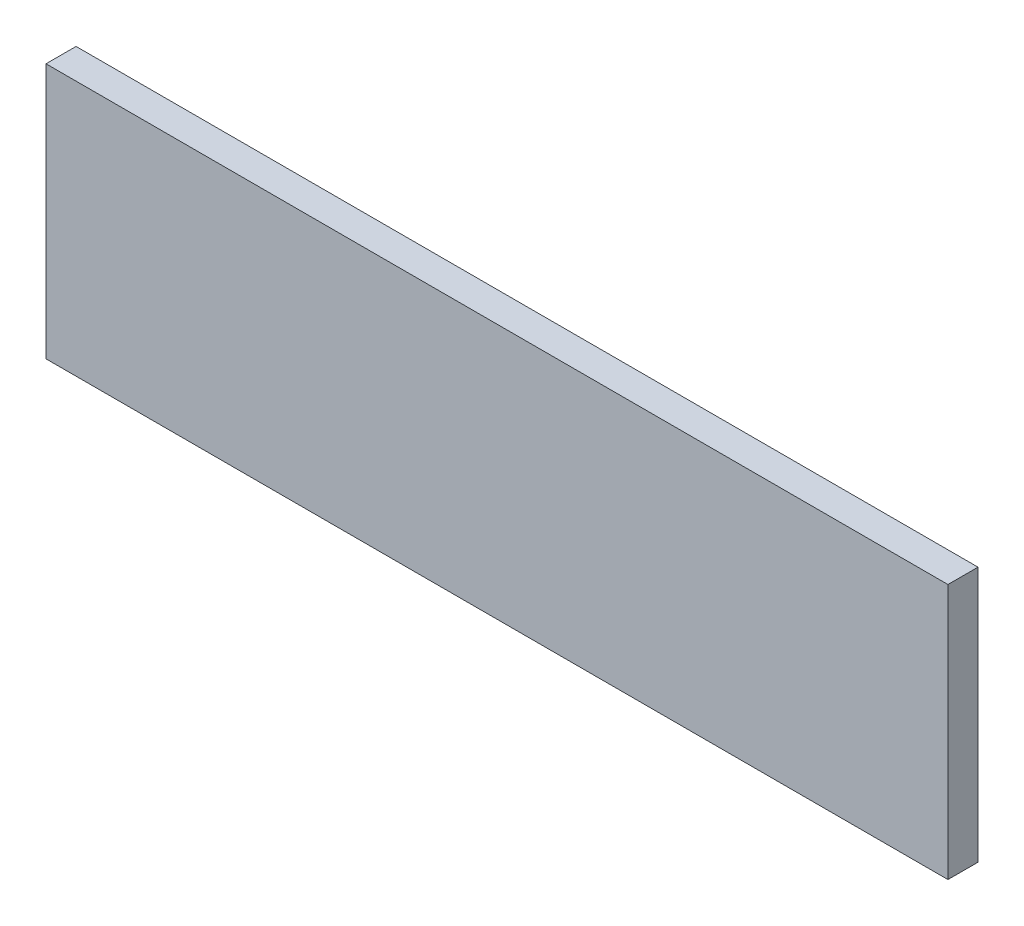
ISO-10303-21;
HEADER;
FILE_DESCRIPTION(('STEP AP214'),'2;1');
FILE_NAME('part.step','',(''),(''),'','','');
FILE_SCHEMA(('AUTOMOTIVE_DESIGN { 1 0 10303 214 1 1 1 1 }'));
ENDSEC;
DATA;
#1=APPLICATION_CONTEXT('core data for automotive mechanical design processes');
#2=APPLICATION_PROTOCOL_DEFINITION('international standard','automotive_design',2000,#1);
#3=PRODUCT_CONTEXT('',#1,'mechanical');
#4=PRODUCT('Part','Part','',(#3));
#5=PRODUCT_RELATED_PRODUCT_CATEGORY('part','',(#4));
#6=PRODUCT_DEFINITION_FORMATION('','',#4);
#7=PRODUCT_DEFINITION_CONTEXT('part definition',#1,'design');
#8=PRODUCT_DEFINITION('design','',#6,#7);
#9=PRODUCT_DEFINITION_SHAPE('','',#8);
#10=(LENGTH_UNIT() NAMED_UNIT(*) SI_UNIT(.MILLI.,.METRE.));
#11=(NAMED_UNIT(*) PLANE_ANGLE_UNIT() SI_UNIT($,.RADIAN.));
#12=(NAMED_UNIT(*) SI_UNIT($,.STERADIAN.) SOLID_ANGLE_UNIT());
#13=UNCERTAINTY_MEASURE_WITH_UNIT(LENGTH_MEASURE(1.E-05),#10,'distance_accuracy_value','');
#14=(GEOMETRIC_REPRESENTATION_CONTEXT(3) GLOBAL_UNCERTAINTY_ASSIGNED_CONTEXT((#13)) GLOBAL_UNIT_ASSIGNED_CONTEXT((#10,
#11,#12)) REPRESENTATION_CONTEXT('',''));
#15=CARTESIAN_POINT('',(0.,0.,0.));
#16=DIRECTION('',(0.,0.,1.));
#17=DIRECTION('',(1.,0.,0.));
#18=AXIS2_PLACEMENT_3D('',#15,#16,#17);
#19=CARTESIAN_POINT('',(-36.1662707528454,22.3328025477707,5.));
#20=DIRECTION('',(1.,0.,0.));
#21=DIRECTION('',(0.,0.,-1.));
#22=AXIS2_PLACEMENT_3D('',#19,#20,#21);
#23=PLANE('',#22);
#24=DIRECTION('',(0.,-1.,0.));
#25=VECTOR('',#24,1.);
#26=CARTESIAN_POINT('',(-36.1662707528454,22.3328025477707,0.));
#27=LINE('',#26,#25);
#28=CARTESIAN_POINT('',(-36.1662707528454,22.3328025477707,0.));
#29=VERTEX_POINT('',#28);
#30=CARTESIAN_POINT('',(-36.1662707528454,-20.1671974522293,0.));
#31=VERTEX_POINT('',#30);
#32=EDGE_CURVE('E96',#29,#31,#27,.T.);
#33=ORIENTED_EDGE('',*,*,#32,.T.);
#34=DIRECTION('',(0.,0.,-1.));
#35=VECTOR('',#34,1.);
#36=CARTESIAN_POINT('',(-36.1662707528454,-20.1671974522293,5.));
#37=LINE('',#36,#35);
#38=CARTESIAN_POINT('',(-36.1662707528454,-20.1671974522293,5.));
#39=VERTEX_POINT('',#38);
#40=EDGE_CURVE('E11',#39,#31,#37,.T.);
#41=ORIENTED_EDGE('',*,*,#40,.F.);
#42=DIRECTION('',(0.,-1.,0.));
#43=VECTOR('',#42,1.);
#44=CARTESIAN_POINT('',(-36.1662707528454,22.3328025477707,5.));
#45=LINE('',#44,#43);
#46=CARTESIAN_POINT('',(-36.1662707528454,22.3328025477707,5.));
#47=VERTEX_POINT('',#46);
#48=EDGE_CURVE('E84',#47,#39,#45,.T.);
#49=ORIENTED_EDGE('',*,*,#48,.F.);
#50=DIRECTION('',(0.,0.,-1.));
#51=VECTOR('',#50,1.);
#52=CARTESIAN_POINT('',(-36.1662707528454,22.3328025477707,5.));
#53=LINE('',#52,#51);
#54=EDGE_CURVE('E92',#47,#29,#53,.T.);
#55=ORIENTED_EDGE('',*,*,#54,.T.);
#56=EDGE_LOOP('',(#33,#41,#49,#55));
#57=FACE_BOUND('',#56,.T.);
#58=ADVANCED_FACE('F33',(#57),#23,.F.);
#59=CARTESIAN_POINT('',(-36.1662707528454,-20.1671974522293,5.));
#60=DIRECTION('',(0.,1.,0.));
#61=DIRECTION('',(0.,0.,1.));
#62=AXIS2_PLACEMENT_3D('',#59,#60,#61);
#63=PLANE('',#62);
#64=DIRECTION('',(1.,0.,0.));
#65=VECTOR('',#64,1.);
#66=CARTESIAN_POINT('',(-36.1662707528454,-20.1671974522293,0.));
#67=LINE('',#66,#65);
#68=CARTESIAN_POINT('',(113.833729247155,-20.1671974522293,0.));
#69=VERTEX_POINT('',#68);
#70=EDGE_CURVE('E88',#31,#69,#67,.T.);
#71=ORIENTED_EDGE('',*,*,#70,.T.);
#72=DIRECTION('',(0.,0.,-1.));
#73=VECTOR('',#72,1.);
#74=CARTESIAN_POINT('',(113.833729247155,-20.1671974522293,5.));
#75=LINE('',#74,#73);
#76=CARTESIAN_POINT('',(113.833729247155,-20.1671974522293,5.));
#77=VERTEX_POINT('',#76);
#78=EDGE_CURVE('E41',#77,#69,#75,.T.);
#79=ORIENTED_EDGE('',*,*,#78,.F.);
#80=DIRECTION('',(1.,0.,0.));
#81=VECTOR('',#80,1.);
#82=CARTESIAN_POINT('',(-36.1662707528454,-20.1671974522293,5.));
#83=LINE('',#82,#81);
#84=EDGE_CURVE('E79',#39,#77,#83,.T.);
#85=ORIENTED_EDGE('',*,*,#84,.F.);
#86=ORIENTED_EDGE('',*,*,#40,.T.);
#87=EDGE_LOOP('',(#71,#79,#85,#86));
#88=FACE_BOUND('',#87,.T.);
#89=ADVANCED_FACE('F87',(#88),#63,.F.);
#90=CARTESIAN_POINT('',(113.833729247155,22.3328025477707,5.));
#91=DIRECTION('',(-1.,0.,0.));
#92=DIRECTION('',(0.,0.,1.));
#93=AXIS2_PLACEMENT_3D('',#90,#91,#92);
#94=PLANE('',#93);
#95=DIRECTION('',(0.,1.,0.));
#96=VECTOR('',#95,1.);
#97=CARTESIAN_POINT('',(113.833729247155,22.3328025477707,0.));
#98=LINE('',#97,#96);
#99=CARTESIAN_POINT('',(113.833729247155,22.3328025477707,0.));
#100=VERTEX_POINT('',#99);
#101=EDGE_CURVE('E66',#69,#100,#98,.T.);
#102=ORIENTED_EDGE('',*,*,#101,.T.);
#103=DIRECTION('',(0.,0.,-1.));
#104=VECTOR('',#103,1.);
#105=CARTESIAN_POINT('',(113.833729247155,22.3328025477707,5.));
#106=LINE('',#105,#104);
#107=CARTESIAN_POINT('',(113.833729247155,22.3328025477707,5.));
#108=VERTEX_POINT('',#107);
#109=EDGE_CURVE('E89',#108,#100,#106,.T.);
#110=ORIENTED_EDGE('',*,*,#109,.F.);
#111=DIRECTION('',(0.,1.,0.));
#112=VECTOR('',#111,1.);
#113=CARTESIAN_POINT('',(113.833729247155,22.3328025477707,5.));
#114=LINE('',#113,#112);
#115=EDGE_CURVE('E82',#77,#108,#114,.T.);
#116=ORIENTED_EDGE('',*,*,#115,.F.);
#117=ORIENTED_EDGE('',*,*,#78,.T.);
#118=EDGE_LOOP('',(#102,#110,#116,#117));
#119=FACE_BOUND('',#118,.T.);
#120=ADVANCED_FACE('F90',(#119),#94,.F.);
#121=CARTESIAN_POINT('',(-36.1662707528454,22.3328025477707,5.));
#122=DIRECTION('',(0.,-1.,0.));
#123=DIRECTION('',(0.,0.,-1.));
#124=AXIS2_PLACEMENT_3D('',#121,#122,#123);
#125=PLANE('',#124);
#126=DIRECTION('',(-1.,0.,0.));
#127=VECTOR('',#126,1.);
#128=CARTESIAN_POINT('',(-36.1662707528454,22.3328025477707,0.));
#129=LINE('',#128,#127);
#130=EDGE_CURVE('E72',#100,#29,#129,.T.);
#131=ORIENTED_EDGE('',*,*,#130,.T.);
#132=ORIENTED_EDGE('',*,*,#54,.F.);
#133=DIRECTION('',(-1.,0.,0.));
#134=VECTOR('',#133,1.);
#135=CARTESIAN_POINT('',(-36.1662707528454,22.3328025477707,5.));
#136=LINE('',#135,#134);
#137=EDGE_CURVE('E49',#108,#47,#136,.T.);
#138=ORIENTED_EDGE('',*,*,#137,.F.);
#139=ORIENTED_EDGE('',*,*,#109,.T.);
#140=EDGE_LOOP('',(#131,#132,#138,#139));
#141=FACE_BOUND('',#140,.T.);
#142=ADVANCED_FACE('F103',(#141),#125,.F.);
#143=CARTESIAN_POINT('',(0.,0.,5.));
#144=DIRECTION('',(0.,0.,1.));
#145=DIRECTION('',(1.,0.,0.));
#146=AXIS2_PLACEMENT_3D('',#143,#144,#145);
#147=PLANE('',#146);
#148=ORIENTED_EDGE('',*,*,#48,.T.);
#149=ORIENTED_EDGE('',*,*,#84,.T.);
#150=ORIENTED_EDGE('',*,*,#115,.T.);
#151=ORIENTED_EDGE('',*,*,#137,.T.);
#152=EDGE_LOOP('',(#148,#149,#150,#151));
#153=FACE_BOUND('',#152,.T.);
#154=ADVANCED_FACE('F80',(#153),#147,.T.);
#155=CARTESIAN_POINT('',(0.,0.,0.));
#156=DIRECTION('',(0.,0.,1.));
#157=DIRECTION('',(1.,0.,0.));
#158=AXIS2_PLACEMENT_3D('',#155,#156,#157);
#159=PLANE('',#158);
#160=ORIENTED_EDGE('',*,*,#32,.F.);
#161=ORIENTED_EDGE('',*,*,#130,.F.);
#162=ORIENTED_EDGE('',*,*,#101,.F.);
#163=ORIENTED_EDGE('',*,*,#70,.F.);
#164=EDGE_LOOP('',(#160,#161,#162,#163));
#165=FACE_BOUND('',#164,.T.);
#166=ADVANCED_FACE('F106',(#165),#159,.F.);
#167=CLOSED_SHELL('',(#58,#89,#120,#142,#154,#166));
#168=MANIFOLD_SOLID_BREP('B2',#167);
#169=ADVANCED_BREP_SHAPE_REPRESENTATION('',(#18,#168),#14);
#170=SHAPE_DEFINITION_REPRESENTATION(#9,#169);
ENDSEC;
END-ISO-10303-21;
